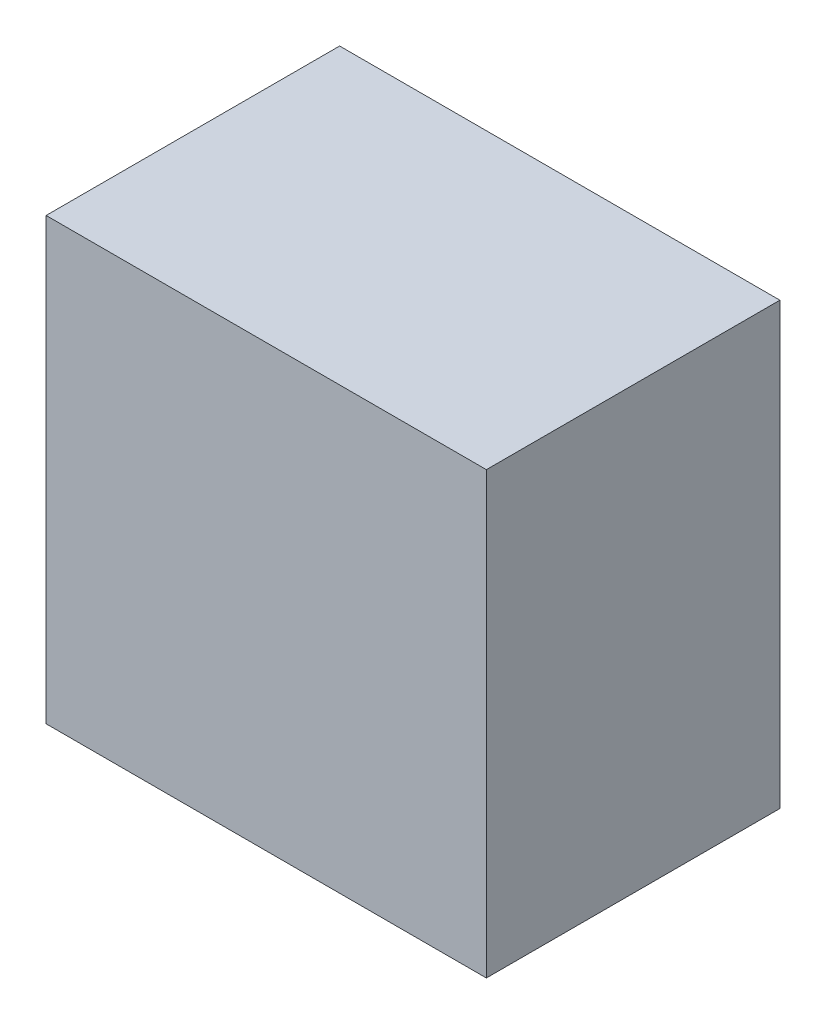
ISO-10303-21;
HEADER;
FILE_DESCRIPTION(('STEP AP214'),'2;1');
FILE_NAME('part.step','',(''),(''),'','','');
FILE_SCHEMA(('AUTOMOTIVE_DESIGN { 1 0 10303 214 1 1 1 1 }'));
ENDSEC;
DATA;
#1=APPLICATION_CONTEXT('core data for automotive mechanical design processes');
#2=APPLICATION_PROTOCOL_DEFINITION('international standard','automotive_design',2000,#1);
#3=PRODUCT_CONTEXT('',#1,'mechanical');
#4=PRODUCT('Part','Part','',(#3));
#5=PRODUCT_RELATED_PRODUCT_CATEGORY('part','',(#4));
#6=PRODUCT_DEFINITION_FORMATION('','',#4);
#7=PRODUCT_DEFINITION_CONTEXT('part definition',#1,'design');
#8=PRODUCT_DEFINITION('design','',#6,#7);
#9=PRODUCT_DEFINITION_SHAPE('','',#8);
#10=(LENGTH_UNIT() NAMED_UNIT(*) SI_UNIT(.MILLI.,.METRE.));
#11=(NAMED_UNIT(*) PLANE_ANGLE_UNIT() SI_UNIT($,.RADIAN.));
#12=(NAMED_UNIT(*) SI_UNIT($,.STERADIAN.) SOLID_ANGLE_UNIT());
#13=UNCERTAINTY_MEASURE_WITH_UNIT(LENGTH_MEASURE(1.E-05),#10,'distance_accuracy_value','');
#14=(GEOMETRIC_REPRESENTATION_CONTEXT(3) GLOBAL_UNCERTAINTY_ASSIGNED_CONTEXT((#13)) GLOBAL_UNIT_ASSIGNED_CONTEXT((#10,
#11,#12)) REPRESENTATION_CONTEXT('',''));
#15=CARTESIAN_POINT('',(0.,0.,0.));
#16=DIRECTION('',(0.,0.,1.));
#17=DIRECTION('',(1.,0.,0.));
#18=AXIS2_PLACEMENT_3D('',#15,#16,#17);
#19=CARTESIAN_POINT('',(0.,0.,200.));
#20=DIRECTION('',(1.,0.,0.));
#21=DIRECTION('',(0.,0.,-1.));
#22=AXIS2_PLACEMENT_3D('',#19,#20,#21);
#23=PLANE('',#22);
#24=DIRECTION('',(0.,-1.,0.));
#25=VECTOR('',#24,1.);
#26=CARTESIAN_POINT('',(0.,0.,0.));
#27=LINE('',#26,#25);
#28=CARTESIAN_POINT('',(0.,0.,0.));
#29=VERTEX_POINT('',#28);
#30=CARTESIAN_POINT('',(0.,-300.,0.));
#31=VERTEX_POINT('',#30);
#32=EDGE_CURVE('E96',#29,#31,#27,.T.);
#33=ORIENTED_EDGE('',*,*,#32,.T.);
#34=DIRECTION('',(0.,0.,-1.));
#35=VECTOR('',#34,1.);
#36=CARTESIAN_POINT('',(0.,-300.,200.));
#37=LINE('',#36,#35);
#38=CARTESIAN_POINT('',(0.,-300.,200.));
#39=VERTEX_POINT('',#38);
#40=EDGE_CURVE('E11',#39,#31,#37,.T.);
#41=ORIENTED_EDGE('',*,*,#40,.F.);
#42=DIRECTION('',(0.,-1.,0.));
#43=VECTOR('',#42,1.);
#44=CARTESIAN_POINT('',(0.,0.,200.));
#45=LINE('',#44,#43);
#46=CARTESIAN_POINT('',(0.,0.,200.));
#47=VERTEX_POINT('',#46);
#48=EDGE_CURVE('E84',#47,#39,#45,.T.);
#49=ORIENTED_EDGE('',*,*,#48,.F.);
#50=DIRECTION('',(0.,0.,-1.));
#51=VECTOR('',#50,1.);
#52=CARTESIAN_POINT('',(0.,0.,200.));
#53=LINE('',#52,#51);
#54=EDGE_CURVE('E92',#47,#29,#53,.T.);
#55=ORIENTED_EDGE('',*,*,#54,.T.);
#56=EDGE_LOOP('',(#33,#41,#49,#55));
#57=FACE_BOUND('',#56,.T.);
#58=ADVANCED_FACE('F33',(#57),#23,.F.);
#59=CARTESIAN_POINT('',(0.,-300.,200.));
#60=DIRECTION('',(0.,1.,0.));
#61=DIRECTION('',(0.,0.,1.));
#62=AXIS2_PLACEMENT_3D('',#59,#60,#61);
#63=PLANE('',#62);
#64=DIRECTION('',(1.,0.,0.));
#65=VECTOR('',#64,1.);
#66=CARTESIAN_POINT('',(0.,-300.,0.));
#67=LINE('',#66,#65);
#68=CARTESIAN_POINT('',(300.,-300.,0.));
#69=VERTEX_POINT('',#68);
#70=EDGE_CURVE('E88',#31,#69,#67,.T.);
#71=ORIENTED_EDGE('',*,*,#70,.T.);
#72=DIRECTION('',(0.,0.,-1.));
#73=VECTOR('',#72,1.);
#74=CARTESIAN_POINT('',(300.,-300.,200.));
#75=LINE('',#74,#73);
#76=CARTESIAN_POINT('',(300.,-300.,200.));
#77=VERTEX_POINT('',#76);
#78=EDGE_CURVE('E41',#77,#69,#75,.T.);
#79=ORIENTED_EDGE('',*,*,#78,.F.);
#80=DIRECTION('',(1.,0.,0.));
#81=VECTOR('',#80,1.);
#82=CARTESIAN_POINT('',(0.,-300.,200.));
#83=LINE('',#82,#81);
#84=EDGE_CURVE('E79',#39,#77,#83,.T.);
#85=ORIENTED_EDGE('',*,*,#84,.F.);
#86=ORIENTED_EDGE('',*,*,#40,.T.);
#87=EDGE_LOOP('',(#71,#79,#85,#86));
#88=FACE_BOUND('',#87,.T.);
#89=ADVANCED_FACE('F87',(#88),#63,.F.);
#90=CARTESIAN_POINT('',(300.,0.,200.));
#91=DIRECTION('',(-1.,0.,0.));
#92=DIRECTION('',(0.,-1.,0.));
#93=AXIS2_PLACEMENT_3D('',#90,#91,#92);
#94=PLANE('',#93);
#95=DIRECTION('',(0.,1.,0.));
#96=VECTOR('',#95,1.);
#97=CARTESIAN_POINT('',(300.,0.,0.));
#98=LINE('',#97,#96);
#99=CARTESIAN_POINT('',(300.,0.,0.));
#100=VERTEX_POINT('',#99);
#101=EDGE_CURVE('E66',#69,#100,#98,.T.);
#102=ORIENTED_EDGE('',*,*,#101,.T.);
#103=DIRECTION('',(0.,0.,-1.));
#104=VECTOR('',#103,1.);
#105=CARTESIAN_POINT('',(300.,0.,200.));
#106=LINE('',#105,#104);
#107=CARTESIAN_POINT('',(300.,0.,200.));
#108=VERTEX_POINT('',#107);
#109=EDGE_CURVE('E89',#108,#100,#106,.T.);
#110=ORIENTED_EDGE('',*,*,#109,.F.);
#111=DIRECTION('',(0.,1.,0.));
#112=VECTOR('',#111,1.);
#113=CARTESIAN_POINT('',(300.,0.,200.));
#114=LINE('',#113,#112);
#115=EDGE_CURVE('E82',#77,#108,#114,.T.);
#116=ORIENTED_EDGE('',*,*,#115,.F.);
#117=ORIENTED_EDGE('',*,*,#78,.T.);
#118=EDGE_LOOP('',(#102,#110,#116,#117));
#119=FACE_BOUND('',#118,.T.);
#120=ADVANCED_FACE('F90',(#119),#94,.F.);
#121=CARTESIAN_POINT('',(0.,0.,200.));
#122=DIRECTION('',(0.,-1.,0.));
#123=DIRECTION('',(0.,0.,-1.));
#124=AXIS2_PLACEMENT_3D('',#121,#122,#123);
#125=PLANE('',#124);
#126=DIRECTION('',(-1.,0.,0.));
#127=VECTOR('',#126,1.);
#128=CARTESIAN_POINT('',(0.,0.,0.));
#129=LINE('',#128,#127);
#130=EDGE_CURVE('E72',#100,#29,#129,.T.);
#131=ORIENTED_EDGE('',*,*,#130,.T.);
#132=ORIENTED_EDGE('',*,*,#54,.F.);
#133=DIRECTION('',(-1.,0.,0.));
#134=VECTOR('',#133,1.);
#135=CARTESIAN_POINT('',(0.,0.,200.));
#136=LINE('',#135,#134);
#137=EDGE_CURVE('E49',#108,#47,#136,.T.);
#138=ORIENTED_EDGE('',*,*,#137,.F.);
#139=ORIENTED_EDGE('',*,*,#109,.T.);
#140=EDGE_LOOP('',(#131,#132,#138,#139));
#141=FACE_BOUND('',#140,.T.);
#142=ADVANCED_FACE('F103',(#141),#125,.F.);
#143=CARTESIAN_POINT('',(0.,0.,200.));
#144=DIRECTION('',(0.,0.,1.));
#145=DIRECTION('',(1.,0.,0.));
#146=AXIS2_PLACEMENT_3D('',#143,#144,#145);
#147=PLANE('',#146);
#148=ORIENTED_EDGE('',*,*,#48,.T.);
#149=ORIENTED_EDGE('',*,*,#84,.T.);
#150=ORIENTED_EDGE('',*,*,#115,.T.);
#151=ORIENTED_EDGE('',*,*,#137,.T.);
#152=EDGE_LOOP('',(#148,#149,#150,#151));
#153=FACE_BOUND('',#152,.T.);
#154=ADVANCED_FACE('F80',(#153),#147,.T.);
#155=CARTESIAN_POINT('',(0.,0.,0.));
#156=DIRECTION('',(0.,0.,1.));
#157=DIRECTION('',(1.,0.,0.));
#158=AXIS2_PLACEMENT_3D('',#155,#156,#157);
#159=PLANE('',#158);
#160=ORIENTED_EDGE('',*,*,#32,.F.);
#161=ORIENTED_EDGE('',*,*,#130,.F.);
#162=ORIENTED_EDGE('',*,*,#101,.F.);
#163=ORIENTED_EDGE('',*,*,#70,.F.);
#164=EDGE_LOOP('',(#160,#161,#162,#163));
#165=FACE_BOUND('',#164,.T.);
#166=ADVANCED_FACE('F106',(#165),#159,.F.);
#167=CLOSED_SHELL('',(#58,#89,#120,#142,#154,#166));
#168=MANIFOLD_SOLID_BREP('B2',#167);
#169=ADVANCED_BREP_SHAPE_REPRESENTATION('',(#18,#168),#14);
#170=SHAPE_DEFINITION_REPRESENTATION(#9,#169);
ENDSEC;
END-ISO-10303-21;
